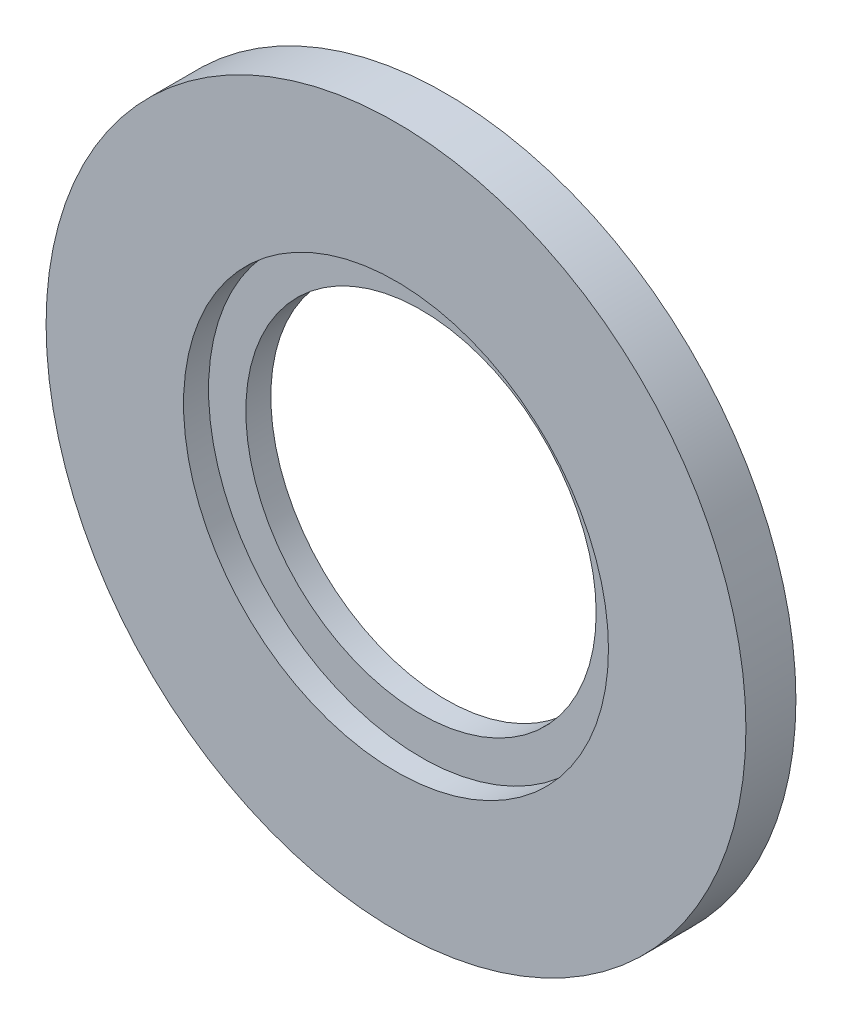
ISO-10303-21;
HEADER;
FILE_DESCRIPTION(('STEP AP214'),'2;1');
FILE_NAME('part.step','',(''),(''),'','','');
FILE_SCHEMA(('AUTOMOTIVE_DESIGN { 1 0 10303 214 1 1 1 1 }'));
ENDSEC;
DATA;
#1=APPLICATION_CONTEXT('core data for automotive mechanical design processes');
#2=APPLICATION_PROTOCOL_DEFINITION('international standard','automotive_design',2000,#1);
#3=PRODUCT_CONTEXT('',#1,'mechanical');
#4=PRODUCT('Part','Part','',(#3));
#5=PRODUCT_RELATED_PRODUCT_CATEGORY('part','',(#4));
#6=PRODUCT_DEFINITION_FORMATION('','',#4);
#7=PRODUCT_DEFINITION_CONTEXT('part definition',#1,'design');
#8=PRODUCT_DEFINITION('design','',#6,#7);
#9=PRODUCT_DEFINITION_SHAPE('','',#8);
#10=(LENGTH_UNIT() NAMED_UNIT(*) SI_UNIT(.MILLI.,.METRE.));
#11=(NAMED_UNIT(*) PLANE_ANGLE_UNIT() SI_UNIT($,.RADIAN.));
#12=(NAMED_UNIT(*) SI_UNIT($,.STERADIAN.) SOLID_ANGLE_UNIT());
#13=UNCERTAINTY_MEASURE_WITH_UNIT(LENGTH_MEASURE(1.E-05),#10,'distance_accuracy_value','');
#14=(GEOMETRIC_REPRESENTATION_CONTEXT(3) GLOBAL_UNCERTAINTY_ASSIGNED_CONTEXT((#13)) GLOBAL_UNIT_ASSIGNED_CONTEXT((#10,
#11,#12)) REPRESENTATION_CONTEXT('',''));
#15=CARTESIAN_POINT('',(0.,0.,0.));
#16=DIRECTION('',(0.,0.,1.));
#17=DIRECTION('',(1.,0.,0.));
#18=AXIS2_PLACEMENT_3D('',#15,#16,#17);
#19=CARTESIAN_POINT('',(0.,0.,3.175));
#20=DIRECTION('',(0.,0.,-1.));
#21=DIRECTION('',(-1.,0.,0.));
#22=AXIS2_PLACEMENT_3D('',#19,#20,#21);
#23=CYLINDRICAL_SURFACE('',#22,11.1252);
#24=CARTESIAN_POINT('',(0.,0.,0.));
#25=DIRECTION('',(0.,0.,1.));
#26=DIRECTION('',(1.,0.,0.));
#27=AXIS2_PLACEMENT_3D('',#24,#25,#26);
#28=CIRCLE('',#27,11.1252);
#29=CARTESIAN_POINT('',(11.1252,0.,0.));
#30=VERTEX_POINT('',#29);
#31=EDGE_CURVE('E48',#30,#30,#28,.T.);
#32=ORIENTED_EDGE('',*,*,#31,.F.);
#33=EDGE_LOOP('',(#32));
#34=FACE_BOUND('',#33,.T.);
#35=CARTESIAN_POINT('',(0.,0.,1.5875));
#36=DIRECTION('',(0.,0.,1.));
#37=DIRECTION('',(1.,0.,0.));
#38=AXIS2_PLACEMENT_3D('',#35,#36,#37);
#39=CIRCLE('',#38,11.1252);
#40=CARTESIAN_POINT('',(11.1252,0.,1.5875));
#41=VERTEX_POINT('',#40);
#42=EDGE_CURVE('E39',#41,#41,#39,.T.);
#43=ORIENTED_EDGE('',*,*,#42,.T.);
#44=EDGE_LOOP('',(#43));
#45=FACE_BOUND('',#44,.T.);
#46=ADVANCED_FACE('F35',(#34,#45),#23,.F.);
#47=CARTESIAN_POINT('',(0.,0.,3.175));
#48=DIRECTION('',(0.,0.,1.));
#49=DIRECTION('',(1.,0.,0.));
#50=AXIS2_PLACEMENT_3D('',#47,#48,#49);
#51=PLANE('',#50);
#52=CARTESIAN_POINT('',(0.,0.,3.175));
#53=DIRECTION('',(0.,0.,1.));
#54=DIRECTION('',(1.,0.,0.));
#55=AXIS2_PLACEMENT_3D('',#52,#53,#54);
#56=CIRCLE('',#55,13.49375);
#57=CARTESIAN_POINT('',(13.49375,0.,3.175));
#58=VERTEX_POINT('',#57);
#59=EDGE_CURVE('E52',#58,#58,#56,.T.);
#60=ORIENTED_EDGE('',*,*,#59,.F.);
#61=EDGE_LOOP('',(#60));
#62=FACE_BOUND('',#61,.T.);
#63=CARTESIAN_POINT('',(0.,0.,3.175));
#64=DIRECTION('',(0.,0.,1.));
#65=DIRECTION('',(1.,0.,0.));
#66=AXIS2_PLACEMENT_3D('',#63,#64,#65);
#67=CIRCLE('',#66,22.225);
#68=CARTESIAN_POINT('',(22.225,0.,3.175));
#69=VERTEX_POINT('',#68);
#70=EDGE_CURVE('E10',#69,#69,#67,.T.);
#71=ORIENTED_EDGE('',*,*,#70,.T.);
#72=EDGE_LOOP('',(#71));
#73=FACE_BOUND('',#72,.T.);
#74=ADVANCED_FACE('F73',(#62,#73),#51,.T.);
#75=CARTESIAN_POINT('',(0.,0.,0.));
#76=DIRECTION('',(0.,0.,1.));
#77=DIRECTION('',(1.,0.,0.));
#78=AXIS2_PLACEMENT_3D('',#75,#76,#77);
#79=PLANE('',#78);
#80=CARTESIAN_POINT('',(0.,0.,0.));
#81=DIRECTION('',(0.,0.,1.));
#82=DIRECTION('',(1.,0.,0.));
#83=AXIS2_PLACEMENT_3D('',#80,#81,#82);
#84=CIRCLE('',#83,22.225);
#85=CARTESIAN_POINT('',(22.225,0.,0.));
#86=VERTEX_POINT('',#85);
#87=EDGE_CURVE('E43',#86,#86,#84,.T.);
#88=ORIENTED_EDGE('',*,*,#87,.F.);
#89=EDGE_LOOP('',(#88));
#90=FACE_BOUND('',#89,.T.);
#91=ORIENTED_EDGE('',*,*,#31,.T.);
#92=EDGE_LOOP('',(#91));
#93=FACE_BOUND('',#92,.T.);
#94=ADVANCED_FACE('F79',(#90,#93),#79,.F.);
#95=CARTESIAN_POINT('',(0.,0.,3.175));
#96=DIRECTION('',(0.,0.,-1.));
#97=DIRECTION('',(-1.,0.,0.));
#98=AXIS2_PLACEMENT_3D('',#95,#96,#97);
#99=CYLINDRICAL_SURFACE('',#98,22.225);
#100=ORIENTED_EDGE('',*,*,#70,.F.);
#101=EDGE_LOOP('',(#100));
#102=FACE_BOUND('',#101,.T.);
#103=ORIENTED_EDGE('',*,*,#87,.T.);
#104=EDGE_LOOP('',(#103));
#105=FACE_BOUND('',#104,.T.);
#106=ADVANCED_FACE('F37',(#102,#105),#99,.T.);
#107=CARTESIAN_POINT('',(0.,0.,1.5875));
#108=DIRECTION('',(0.,0.,1.));
#109=DIRECTION('',(1.,0.,0.));
#110=AXIS2_PLACEMENT_3D('',#107,#108,#109);
#111=CYLINDRICAL_SURFACE('',#110,13.49375);
#112=CARTESIAN_POINT('',(0.,0.,1.5875));
#113=DIRECTION('',(0.,0.,1.));
#114=DIRECTION('',(1.,0.,0.));
#115=AXIS2_PLACEMENT_3D('',#112,#113,#114);
#116=CIRCLE('',#115,13.49375);
#117=CARTESIAN_POINT('',(13.49375,0.,1.5875));
#118=VERTEX_POINT('',#117);
#119=EDGE_CURVE('E55',#118,#118,#116,.T.);
#120=ORIENTED_EDGE('',*,*,#119,.F.);
#121=EDGE_LOOP('',(#120));
#122=FACE_BOUND('',#121,.T.);
#123=ORIENTED_EDGE('',*,*,#59,.T.);
#124=EDGE_LOOP('',(#123));
#125=FACE_BOUND('',#124,.T.);
#126=ADVANCED_FACE('F65',(#122,#125),#111,.F.);
#127=CARTESIAN_POINT('',(0.,0.,1.5875));
#128=DIRECTION('',(0.,0.,1.));
#129=DIRECTION('',(1.,0.,0.));
#130=AXIS2_PLACEMENT_3D('',#127,#128,#129);
#131=PLANE('',#130);
#132=ORIENTED_EDGE('',*,*,#42,.F.);
#133=EDGE_LOOP('',(#132));
#134=FACE_BOUND('',#133,.T.);
#135=ORIENTED_EDGE('',*,*,#119,.T.);
#136=EDGE_LOOP('',(#135));
#137=FACE_BOUND('',#136,.T.);
#138=ADVANCED_FACE('F63',(#134,#137),#131,.T.);
#139=CLOSED_SHELL('',(#46,#74,#94,#106,#126,#138));
#140=MANIFOLD_SOLID_BREP('B2',#139);
#141=ADVANCED_BREP_SHAPE_REPRESENTATION('',(#18,#140),#14);
#142=SHAPE_DEFINITION_REPRESENTATION(#9,#141);
ENDSEC;
END-ISO-10303-21;
